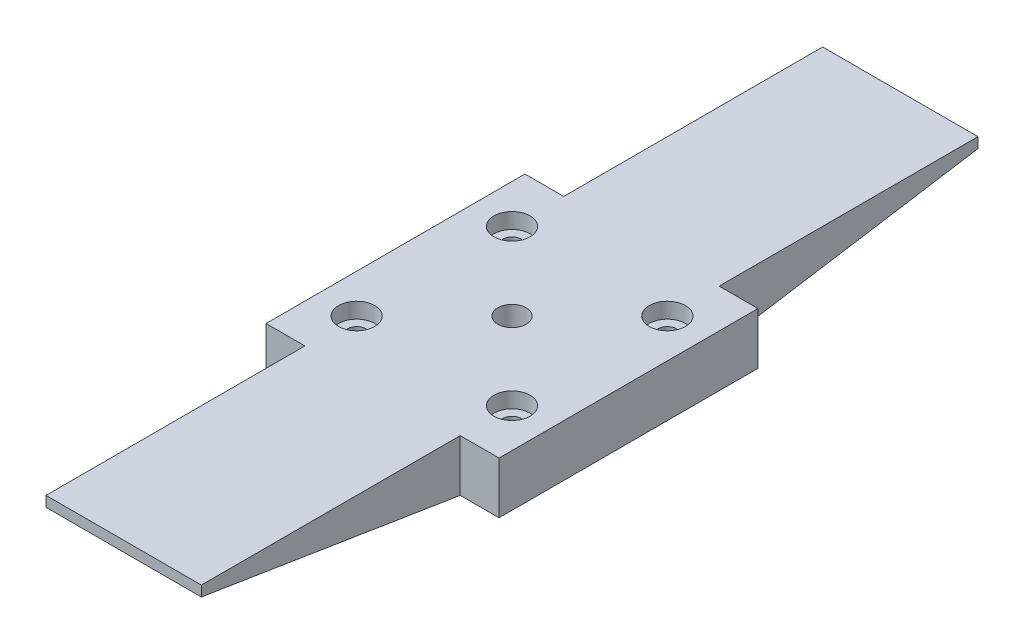
ISO-10303-21;
HEADER;
FILE_DESCRIPTION(('STEP AP214'),'2;1');
FILE_NAME('part.step','',(''),(''),'','','');
FILE_SCHEMA(('AUTOMOTIVE_DESIGN { 1 0 10303 214 1 1 1 1 }'));
ENDSEC;
DATA;
#1=APPLICATION_CONTEXT('core data for automotive mechanical design processes');
#2=APPLICATION_PROTOCOL_DEFINITION('international standard','automotive_design',2000,#1);
#3=PRODUCT_CONTEXT('',#1,'mechanical');
#4=PRODUCT('Part','Part','',(#3));
#5=PRODUCT_RELATED_PRODUCT_CATEGORY('part','',(#4));
#6=PRODUCT_DEFINITION_FORMATION('','',#4);
#7=PRODUCT_DEFINITION_CONTEXT('part definition',#1,'design');
#8=PRODUCT_DEFINITION('design','',#6,#7);
#9=PRODUCT_DEFINITION_SHAPE('','',#8);
#10=(LENGTH_UNIT() NAMED_UNIT(*) SI_UNIT(.MILLI.,.METRE.));
#11=(NAMED_UNIT(*) PLANE_ANGLE_UNIT() SI_UNIT($,.RADIAN.));
#12=(NAMED_UNIT(*) SI_UNIT($,.STERADIAN.) SOLID_ANGLE_UNIT());
#13=UNCERTAINTY_MEASURE_WITH_UNIT(LENGTH_MEASURE(1.E-05),#10,'distance_accuracy_value','');
#14=(GEOMETRIC_REPRESENTATION_CONTEXT(3) GLOBAL_UNCERTAINTY_ASSIGNED_CONTEXT((#13)) GLOBAL_UNIT_ASSIGNED_CONTEXT((#10,
#11,#12)) REPRESENTATION_CONTEXT('',''));
#15=CARTESIAN_POINT('',(0.,0.,0.));
#16=DIRECTION('',(0.,0.,1.));
#17=DIRECTION('',(1.,0.,0.));
#18=AXIS2_PLACEMENT_3D('',#15,#16,#17);
#19=CARTESIAN_POINT('',(45.,0.,-75.));
#20=DIRECTION('',(0.,0.,1.));
#21=DIRECTION('',(1.,0.,0.));
#22=AXIS2_PLACEMENT_3D('',#19,#20,#21);
#23=PLANE('',#22);
#24=DIRECTION('',(0.,1.,0.));
#25=VECTOR('',#24,1.);
#26=CARTESIAN_POINT('',(7.5,-2.,-75.));
#27=LINE('',#26,#25);
#28=CARTESIAN_POINT('',(7.5,-2.,-75.));
#29=VERTEX_POINT('',#28);
#30=CARTESIAN_POINT('',(7.5,0.,-75.));
#31=VERTEX_POINT('',#30);
#32=EDGE_CURVE('E143',#29,#31,#27,.T.);
#33=ORIENTED_EDGE('',*,*,#32,.T.);
#34=DIRECTION('',(-1.,0.,0.));
#35=VECTOR('',#34,1.);
#36=CARTESIAN_POINT('',(45.,0.,-75.));
#37=LINE('',#36,#35);
#38=CARTESIAN_POINT('',(37.5,0.,-75.));
#39=VERTEX_POINT('',#38);
#40=EDGE_CURVE('E11',#39,#31,#37,.T.);
#41=ORIENTED_EDGE('',*,*,#40,.F.);
#42=DIRECTION('',(0.,1.,0.));
#43=VECTOR('',#42,1.);
#44=CARTESIAN_POINT('',(37.5,-2.,-75.));
#45=LINE('',#44,#43);
#46=CARTESIAN_POINT('',(37.5,-2.,-75.));
#47=VERTEX_POINT('',#46);
#48=EDGE_CURVE('E261',#47,#39,#45,.T.);
#49=ORIENTED_EDGE('',*,*,#48,.F.);
#50=DIRECTION('',(-1.,0.,0.));
#51=VECTOR('',#50,1.);
#52=CARTESIAN_POINT('',(45.,-2.,-75.));
#53=LINE('',#52,#51);
#54=EDGE_CURVE('E164',#47,#29,#53,.T.);
#55=ORIENTED_EDGE('',*,*,#54,.T.);
#56=EDGE_LOOP('',(#33,#41,#49,#55));
#57=FACE_BOUND('',#56,.T.);
#58=ADVANCED_FACE('F37',(#57),#23,.F.);
#59=CARTESIAN_POINT('',(45.,-2.,-75.));
#60=DIRECTION('',(0.,0.987440631916705,0.157990501106673));
#61=DIRECTION('',(0.,-0.157990501106673,0.987440631916706));
#62=AXIS2_PLACEMENT_3D('',#59,#60,#61);
#63=PLANE('',#62);
#64=DIRECTION('',(0.,0.157990501106673,-0.987440631916706));
#65=VECTOR('',#64,1.);
#66=CARTESIAN_POINT('',(7.5,-10.,-25.));
#67=LINE('',#66,#65);
#68=CARTESIAN_POINT('',(7.5,-10.,-25.));
#69=VERTEX_POINT('',#68);
#70=EDGE_CURVE('E138',#69,#29,#67,.T.);
#71=ORIENTED_EDGE('',*,*,#70,.T.);
#72=ORIENTED_EDGE('',*,*,#54,.F.);
#73=DIRECTION('',(0.,0.157990501106673,-0.987440631916706));
#74=VECTOR('',#73,1.);
#75=CARTESIAN_POINT('',(37.5,-10.,-25.));
#76=LINE('',#75,#74);
#77=CARTESIAN_POINT('',(37.5,-10.,-25.));
#78=VERTEX_POINT('',#77);
#79=EDGE_CURVE('E162',#78,#47,#76,.T.);
#80=ORIENTED_EDGE('',*,*,#79,.F.);
#81=DIRECTION('',(-1.,0.,0.));
#82=VECTOR('',#81,1.);
#83=CARTESIAN_POINT('',(45.,-10.,-25.));
#84=LINE('',#83,#82);
#85=EDGE_CURVE('E155',#78,#69,#84,.T.);
#86=ORIENTED_EDGE('',*,*,#85,.T.);
#87=EDGE_LOOP('',(#71,#72,#80,#86));
#88=FACE_BOUND('',#87,.T.);
#89=ADVANCED_FACE('F161',(#88),#63,.F.);
#90=CARTESIAN_POINT('',(45.,0.,75.));
#91=DIRECTION('',(0.,-1.,0.));
#92=DIRECTION('',(0.,0.,-1.));
#93=AXIS2_PLACEMENT_3D('',#90,#91,#92);
#94=PLANE('',#93);
#95=CARTESIAN_POINT('',(22.5,0.,0.));
#96=DIRECTION('',(0.,-1.,0.));
#97=DIRECTION('',(0.,0.,-1.));
#98=AXIS2_PLACEMENT_3D('',#95,#96,#97);
#99=CIRCLE('',#98,2.75);
#100=CARTESIAN_POINT('',(22.5,0.,-2.75));
#101=VERTEX_POINT('',#100);
#102=EDGE_CURVE('E245',#101,#101,#99,.F.);
#103=ORIENTED_EDGE('',*,*,#102,.F.);
#104=EDGE_LOOP('',(#103));
#105=FACE_BOUND('',#104,.T.);
#106=CARTESIAN_POINT('',(37.5,0.,-15.));
#107=DIRECTION('',(0.,1.,0.));
#108=DIRECTION('',(0.,0.,1.));
#109=AXIS2_PLACEMENT_3D('',#106,#107,#108);
#110=CIRCLE('',#109,3.5);
#111=CARTESIAN_POINT('',(37.5,0.,-11.5));
#112=VERTEX_POINT('',#111);
#113=EDGE_CURVE('E293',#112,#112,#110,.T.);
#114=ORIENTED_EDGE('',*,*,#113,.F.);
#115=EDGE_LOOP('',(#114));
#116=FACE_BOUND('',#115,.T.);
#117=CARTESIAN_POINT('',(7.5,0.,15.));
#118=DIRECTION('',(0.,1.,0.));
#119=DIRECTION('',(0.,0.,1.));
#120=AXIS2_PLACEMENT_3D('',#117,#118,#119);
#121=CIRCLE('',#120,3.5);
#122=CARTESIAN_POINT('',(7.5,0.,18.5));
#123=VERTEX_POINT('',#122);
#124=EDGE_CURVE('E300',#123,#123,#121,.T.);
#125=ORIENTED_EDGE('',*,*,#124,.F.);
#126=EDGE_LOOP('',(#125));
#127=FACE_BOUND('',#126,.T.);
#128=CARTESIAN_POINT('',(37.5,0.,15.));
#129=DIRECTION('',(0.,1.,0.));
#130=DIRECTION('',(0.,0.,1.));
#131=AXIS2_PLACEMENT_3D('',#128,#129,#130);
#132=CIRCLE('',#131,3.5);
#133=CARTESIAN_POINT('',(37.5,0.,18.5));
#134=VERTEX_POINT('',#133);
#135=EDGE_CURVE('E287',#134,#134,#132,.T.);
#136=ORIENTED_EDGE('',*,*,#135,.F.);
#137=EDGE_LOOP('',(#136));
#138=FACE_BOUND('',#137,.T.);
#139=CARTESIAN_POINT('',(7.5,0.,-15.));
#140=DIRECTION('',(0.,1.,0.));
#141=DIRECTION('',(0.,0.,1.));
#142=AXIS2_PLACEMENT_3D('',#139,#140,#141);
#143=CIRCLE('',#142,3.5);
#144=CARTESIAN_POINT('',(7.5,0.,-11.5));
#145=VERTEX_POINT('',#144);
#146=EDGE_CURVE('E296',#145,#145,#143,.T.);
#147=ORIENTED_EDGE('',*,*,#146,.F.);
#148=EDGE_LOOP('',(#147));
#149=FACE_BOUND('',#148,.T.);
#150=DIRECTION('',(-1.,0.,0.));
#151=VECTOR('',#150,1.);
#152=CARTESIAN_POINT('',(7.5,0.,-25.));
#153=LINE('',#152,#151);
#154=CARTESIAN_POINT('',(7.5,0.,-25.));
#155=VERTEX_POINT('',#154);
#156=CARTESIAN_POINT('',(0.,0.,-25.));
#157=VERTEX_POINT('',#156);
#158=EDGE_CURVE('E134',#155,#157,#153,.T.);
#159=ORIENTED_EDGE('',*,*,#158,.T.);
#160=DIRECTION('',(0.,0.,1.));
#161=VECTOR('',#160,1.);
#162=CARTESIAN_POINT('',(0.,0.,75.));
#163=LINE('',#162,#161);
#164=CARTESIAN_POINT('',(0.,0.,25.));
#165=VERTEX_POINT('',#164);
#166=EDGE_CURVE('E228',#157,#165,#163,.T.);
#167=ORIENTED_EDGE('',*,*,#166,.T.);
#168=DIRECTION('',(-1.,0.,0.));
#169=VECTOR('',#168,1.);
#170=CARTESIAN_POINT('',(7.5,0.,25.));
#171=LINE('',#170,#169);
#172=CARTESIAN_POINT('',(7.5,0.,25.));
#173=VERTEX_POINT('',#172);
#174=EDGE_CURVE('E53',#173,#165,#171,.T.);
#175=ORIENTED_EDGE('',*,*,#174,.F.);
#176=DIRECTION('',(0.,0.,1.));
#177=VECTOR('',#176,1.);
#178=CARTESIAN_POINT('',(7.5,0.,25.));
#179=LINE('',#178,#177);
#180=CARTESIAN_POINT('',(7.5,0.,75.));
#181=VERTEX_POINT('',#180);
#182=EDGE_CURVE('E248',#173,#181,#179,.T.);
#183=ORIENTED_EDGE('',*,*,#182,.T.);
#184=DIRECTION('',(-1.,0.,0.));
#185=VECTOR('',#184,1.);
#186=CARTESIAN_POINT('',(45.,0.,75.));
#187=LINE('',#186,#185);
#188=CARTESIAN_POINT('',(37.5,0.,75.));
#189=VERTEX_POINT('',#188);
#190=EDGE_CURVE('E45',#189,#181,#187,.T.);
#191=ORIENTED_EDGE('',*,*,#190,.F.);
#192=DIRECTION('',(0.,0.,1.));
#193=VECTOR('',#192,1.);
#194=CARTESIAN_POINT('',(37.5,0.,25.));
#195=LINE('',#194,#193);
#196=CARTESIAN_POINT('',(37.5,0.,25.));
#197=VERTEX_POINT('',#196);
#198=EDGE_CURVE('E276',#197,#189,#195,.T.);
#199=ORIENTED_EDGE('',*,*,#198,.F.);
#200=DIRECTION('',(1.,0.,0.));
#201=VECTOR('',#200,1.);
#202=CARTESIAN_POINT('',(37.5,0.,25.));
#203=LINE('',#202,#201);
#204=CARTESIAN_POINT('',(45.,0.,25.));
#205=VERTEX_POINT('',#204);
#206=EDGE_CURVE('E273',#197,#205,#203,.T.);
#207=ORIENTED_EDGE('',*,*,#206,.T.);
#208=DIRECTION('',(0.,0.,1.));
#209=VECTOR('',#208,1.);
#210=CARTESIAN_POINT('',(45.,0.,75.));
#211=LINE('',#210,#209);
#212=CARTESIAN_POINT('',(45.,0.,-25.));
#213=VERTEX_POINT('',#212);
#214=EDGE_CURVE('E231',#213,#205,#211,.T.);
#215=ORIENTED_EDGE('',*,*,#214,.F.);
#216=DIRECTION('',(1.,0.,0.));
#217=VECTOR('',#216,1.);
#218=CARTESIAN_POINT('',(37.5,0.,-25.));
#219=LINE('',#218,#217);
#220=CARTESIAN_POINT('',(37.5,0.,-25.));
#221=VERTEX_POINT('',#220);
#222=EDGE_CURVE('E61',#221,#213,#219,.T.);
#223=ORIENTED_EDGE('',*,*,#222,.F.);
#224=DIRECTION('',(0.,0.,1.));
#225=VECTOR('',#224,1.);
#226=CARTESIAN_POINT('',(37.5,0.,-75.));
#227=LINE('',#226,#225);
#228=EDGE_CURVE('E264',#39,#221,#227,.T.);
#229=ORIENTED_EDGE('',*,*,#228,.F.);
#230=ORIENTED_EDGE('',*,*,#40,.T.);
#231=DIRECTION('',(0.,0.,1.));
#232=VECTOR('',#231,1.);
#233=CARTESIAN_POINT('',(7.5,0.,-75.));
#234=LINE('',#233,#232);
#235=EDGE_CURVE('E137',#31,#155,#234,.T.);
#236=ORIENTED_EDGE('',*,*,#235,.T.);
#237=EDGE_LOOP('',(#159,#167,#175,#183,#191,#199,#207,#215,#223,#229,#230,#236));
#238=FACE_BOUND('',#237,.T.);
#239=ADVANCED_FACE('F239',(#105,#116,#127,#138,#149,#238),#94,.F.);
#240=CARTESIAN_POINT('',(0.,0.,0.));
#241=DIRECTION('',(-1.,0.,0.));
#242=DIRECTION('',(0.,0.,1.));
#243=AXIS2_PLACEMENT_3D('',#240,#241,#242);
#244=PLANE('',#243);
#245=ORIENTED_EDGE('',*,*,#166,.F.);
#246=DIRECTION('',(0.,-1.,0.));
#247=VECTOR('',#246,1.);
#248=CARTESIAN_POINT('',(0.,-10.,-25.));
#249=LINE('',#248,#247);
#250=CARTESIAN_POINT('',(0.,-10.,-25.));
#251=VERTEX_POINT('',#250);
#252=EDGE_CURVE('E148',#157,#251,#249,.T.);
#253=ORIENTED_EDGE('',*,*,#252,.T.);
#254=DIRECTION('',(0.,0.,-1.));
#255=VECTOR('',#254,1.);
#256=CARTESIAN_POINT('',(0.,-10.,-25.));
#257=LINE('',#256,#255);
#258=CARTESIAN_POINT('',(0.,-10.,25.));
#259=VERTEX_POINT('',#258);
#260=EDGE_CURVE('E158',#259,#251,#257,.T.);
#261=ORIENTED_EDGE('',*,*,#260,.F.);
#262=DIRECTION('',(0.,1.,0.));
#263=VECTOR('',#262,1.);
#264=CARTESIAN_POINT('',(0.,-10.,25.));
#265=LINE('',#264,#263);
#266=EDGE_CURVE('E243',#259,#165,#265,.T.);
#267=ORIENTED_EDGE('',*,*,#266,.T.);
#268=EDGE_LOOP('',(#245,#253,#261,#267));
#269=FACE_BOUND('',#268,.T.);
#270=ADVANCED_FACE('F242',(#269),#244,.T.);
#271=CARTESIAN_POINT('',(7.5,4.94974746830584,15.));
#272=DIRECTION('',(0.,-1.,0.));
#273=DIRECTION('',(0.,0.,-1.));
#274=AXIS2_PLACEMENT_3D('',#271,#272,#273);
#275=CYLINDRICAL_SURFACE('',#274,1.75);
#276=CARTESIAN_POINT('',(7.5,-8.,15.));
#277=DIRECTION('',(0.,-1.,0.));
#278=DIRECTION('',(0.,0.,-1.));
#279=AXIS2_PLACEMENT_3D('',#276,#277,#278);
#280=CIRCLE('',#279,1.75);
#281=CARTESIAN_POINT('',(7.5,-8.,13.25));
#282=VERTEX_POINT('',#281);
#283=EDGE_CURVE('E203',#282,#282,#280,.T.);
#284=ORIENTED_EDGE('',*,*,#283,.T.);
#285=EDGE_LOOP('',(#284));
#286=FACE_BOUND('',#285,.T.);
#287=CARTESIAN_POINT('',(7.5,-3.,15.));
#288=DIRECTION('',(0.,1.,0.));
#289=DIRECTION('',(0.,0.,1.));
#290=AXIS2_PLACEMENT_3D('',#287,#288,#289);
#291=CIRCLE('',#290,1.75);
#292=CARTESIAN_POINT('',(7.5,-3.,16.75));
#293=VERTEX_POINT('',#292);
#294=EDGE_CURVE('E40',#293,#293,#291,.F.);
#295=ORIENTED_EDGE('',*,*,#294,.F.);
#296=EDGE_LOOP('',(#295));
#297=FACE_BOUND('',#296,.T.);
#298=ADVANCED_FACE('F457',(#286,#297),#275,.F.);
#299=CARTESIAN_POINT('',(7.5,4.94974746830584,-15.));
#300=DIRECTION('',(0.,-1.,0.));
#301=DIRECTION('',(0.,0.,-1.));
#302=AXIS2_PLACEMENT_3D('',#299,#300,#301);
#303=CYLINDRICAL_SURFACE('',#302,1.75);
#304=CARTESIAN_POINT('',(7.5,-8.,-15.));
#305=DIRECTION('',(0.,-1.,0.));
#306=DIRECTION('',(0.,0.,-1.));
#307=AXIS2_PLACEMENT_3D('',#304,#305,#306);
#308=CIRCLE('',#307,1.75);
#309=CARTESIAN_POINT('',(7.5,-8.,-16.75));
#310=VERTEX_POINT('',#309);
#311=EDGE_CURVE('E199',#310,#310,#308,.T.);
#312=ORIENTED_EDGE('',*,*,#311,.T.);
#313=EDGE_LOOP('',(#312));
#314=FACE_BOUND('',#313,.T.);
#315=CARTESIAN_POINT('',(7.5,-3.,-15.));
#316=DIRECTION('',(0.,1.,0.));
#317=DIRECTION('',(0.,0.,1.));
#318=AXIS2_PLACEMENT_3D('',#315,#316,#317);
#319=CIRCLE('',#318,1.75);
#320=CARTESIAN_POINT('',(7.5,-3.,-13.25));
#321=VERTEX_POINT('',#320);
#322=EDGE_CURVE('E185',#321,#321,#319,.F.);
#323=ORIENTED_EDGE('',*,*,#322,.F.);
#324=EDGE_LOOP('',(#323));
#325=FACE_BOUND('',#324,.T.);
#326=ADVANCED_FACE('F311',(#314,#325),#303,.F.);
#327=CARTESIAN_POINT('',(37.5,4.94974746830584,-15.));
#328=DIRECTION('',(0.,-1.,0.));
#329=DIRECTION('',(0.,0.,-1.));
#330=AXIS2_PLACEMENT_3D('',#327,#328,#329);
#331=CYLINDRICAL_SURFACE('',#330,1.75);
#332=CARTESIAN_POINT('',(37.5,-8.,-15.));
#333=DIRECTION('',(0.,-1.,0.));
#334=DIRECTION('',(0.,0.,-1.));
#335=AXIS2_PLACEMENT_3D('',#332,#333,#334);
#336=CIRCLE('',#335,1.75);
#337=CARTESIAN_POINT('',(37.5,-8.,-16.75));
#338=VERTEX_POINT('',#337);
#339=EDGE_CURVE('E194',#338,#338,#336,.T.);
#340=ORIENTED_EDGE('',*,*,#339,.T.);
#341=EDGE_LOOP('',(#340));
#342=FACE_BOUND('',#341,.T.);
#343=CARTESIAN_POINT('',(37.5,-3.,-15.));
#344=DIRECTION('',(0.,1.,0.));
#345=DIRECTION('',(0.,0.,1.));
#346=AXIS2_PLACEMENT_3D('',#343,#344,#345);
#347=CIRCLE('',#346,1.75);
#348=CARTESIAN_POINT('',(37.5,-3.,-13.25));
#349=VERTEX_POINT('',#348);
#350=EDGE_CURVE('E182',#349,#349,#347,.F.);
#351=ORIENTED_EDGE('',*,*,#350,.F.);
#352=EDGE_LOOP('',(#351));
#353=FACE_BOUND('',#352,.T.);
#354=ADVANCED_FACE('F456',(#342,#353),#331,.F.);
#355=CARTESIAN_POINT('',(37.5,4.94974746830584,15.));
#356=DIRECTION('',(0.,-1.,0.));
#357=DIRECTION('',(0.,0.,-1.));
#358=AXIS2_PLACEMENT_3D('',#355,#356,#357);
#359=CYLINDRICAL_SURFACE('',#358,1.75);
#360=CARTESIAN_POINT('',(37.5,-8.,15.));
#361=DIRECTION('',(0.,-1.,0.));
#362=DIRECTION('',(0.,0.,-1.));
#363=AXIS2_PLACEMENT_3D('',#360,#361,#362);
#364=CIRCLE('',#363,1.75);
#365=CARTESIAN_POINT('',(37.5,-8.,13.25));
#366=VERTEX_POINT('',#365);
#367=EDGE_CURVE('E190',#366,#366,#364,.T.);
#368=ORIENTED_EDGE('',*,*,#367,.T.);
#369=EDGE_LOOP('',(#368));
#370=FACE_BOUND('',#369,.T.);
#371=CARTESIAN_POINT('',(37.5,-3.,15.));
#372=DIRECTION('',(0.,1.,0.));
#373=DIRECTION('',(0.,0.,1.));
#374=AXIS2_PLACEMENT_3D('',#371,#372,#373);
#375=CIRCLE('',#374,1.75);
#376=CARTESIAN_POINT('',(37.5,-3.,16.75));
#377=VERTEX_POINT('',#376);
#378=EDGE_CURVE('E179',#377,#377,#375,.F.);
#379=ORIENTED_EDGE('',*,*,#378,.F.);
#380=EDGE_LOOP('',(#379));
#381=FACE_BOUND('',#380,.T.);
#382=ADVANCED_FACE('F460',(#370,#381),#359,.F.);
#383=CARTESIAN_POINT('',(45.,0.,75.));
#384=DIRECTION('',(0.,0.,-1.));
#385=DIRECTION('',(-1.,0.,0.));
#386=AXIS2_PLACEMENT_3D('',#383,#384,#385);
#387=PLANE('',#386);
#388=ORIENTED_EDGE('',*,*,#190,.T.);
#389=DIRECTION('',(0.,-1.,0.));
#390=VECTOR('',#389,1.);
#391=CARTESIAN_POINT('',(7.5,0.,75.));
#392=LINE('',#391,#390);
#393=CARTESIAN_POINT('',(7.5,-2.,75.));
#394=VERTEX_POINT('',#393);
#395=EDGE_CURVE('E244',#181,#394,#392,.T.);
#396=ORIENTED_EDGE('',*,*,#395,.T.);
#397=DIRECTION('',(-1.,0.,0.));
#398=VECTOR('',#397,1.);
#399=CARTESIAN_POINT('',(45.,-2.,75.));
#400=LINE('',#399,#398);
#401=CARTESIAN_POINT('',(37.5,-2.,75.));
#402=VERTEX_POINT('',#401);
#403=EDGE_CURVE('E174',#402,#394,#400,.T.);
#404=ORIENTED_EDGE('',*,*,#403,.F.);
#405=DIRECTION('',(0.,-1.,0.));
#406=VECTOR('',#405,1.);
#407=CARTESIAN_POINT('',(37.5,0.,75.));
#408=LINE('',#407,#406);
#409=EDGE_CURVE('E278',#189,#402,#408,.T.);
#410=ORIENTED_EDGE('',*,*,#409,.F.);
#411=EDGE_LOOP('',(#388,#396,#404,#410));
#412=FACE_BOUND('',#411,.T.);
#413=ADVANCED_FACE('F382',(#412),#387,.F.);
#414=CARTESIAN_POINT('',(45.,-2.,75.));
#415=DIRECTION('',(0.,0.987440631916705,-0.157990501106673));
#416=DIRECTION('',(0.,0.157990501106673,0.987440631916706));
#417=AXIS2_PLACEMENT_3D('',#414,#415,#416);
#418=PLANE('',#417);
#419=ORIENTED_EDGE('',*,*,#403,.T.);
#420=DIRECTION('',(0.,-0.157990501106673,-0.987440631916706));
#421=VECTOR('',#420,1.);
#422=CARTESIAN_POINT('',(7.5,-2.,75.));
#423=LINE('',#422,#421);
#424=CARTESIAN_POINT('',(7.5,-10.,25.));
#425=VERTEX_POINT('',#424);
#426=EDGE_CURVE('E255',#394,#425,#423,.T.);
#427=ORIENTED_EDGE('',*,*,#426,.T.);
#428=DIRECTION('',(-1.,0.,0.));
#429=VECTOR('',#428,1.);
#430=CARTESIAN_POINT('',(45.,-10.,25.));
#431=LINE('',#430,#429);
#432=CARTESIAN_POINT('',(37.5,-10.,25.));
#433=VERTEX_POINT('',#432);
#434=EDGE_CURVE('E166',#433,#425,#431,.T.);
#435=ORIENTED_EDGE('',*,*,#434,.F.);
#436=DIRECTION('',(0.,-0.157990501106673,-0.987440631916706));
#437=VECTOR('',#436,1.);
#438=CARTESIAN_POINT('',(37.5,-2.,75.));
#439=LINE('',#438,#437);
#440=EDGE_CURVE('E283',#402,#433,#439,.T.);
#441=ORIENTED_EDGE('',*,*,#440,.F.);
#442=EDGE_LOOP('',(#419,#427,#435,#441));
#443=FACE_BOUND('',#442,.T.);
#444=ADVANCED_FACE('F331',(#443),#418,.F.);
#445=CARTESIAN_POINT('',(45.,-10.,-25.));
#446=DIRECTION('',(0.,1.,0.));
#447=DIRECTION('',(0.,0.,1.));
#448=AXIS2_PLACEMENT_3D('',#445,#446,#447);
#449=PLANE('',#448);
#450=CARTESIAN_POINT('',(22.5,-10.,0.));
#451=DIRECTION('',(0.,-1.,0.));
#452=DIRECTION('',(0.,0.,-1.));
#453=AXIS2_PLACEMENT_3D('',#450,#451,#452);
#454=CIRCLE('',#453,2.75);
#455=CARTESIAN_POINT('',(22.5,-10.,-2.75));
#456=VERTEX_POINT('',#455);
#457=EDGE_CURVE('E251',#456,#456,#454,.T.);
#458=ORIENTED_EDGE('',*,*,#457,.F.);
#459=EDGE_LOOP('',(#458));
#460=FACE_BOUND('',#459,.T.);
#461=CARTESIAN_POINT('',(7.5,-10.,-15.));
#462=DIRECTION('',(0.,-1.,0.));
#463=DIRECTION('',(0.,0.,-1.));
#464=AXIS2_PLACEMENT_3D('',#461,#462,#463);
#465=CIRCLE('',#464,3.5);
#466=CARTESIAN_POINT('',(7.5,-10.,-18.5));
#467=VERTEX_POINT('',#466);
#468=EDGE_CURVE('E220',#467,#467,#465,.T.);
#469=ORIENTED_EDGE('',*,*,#468,.F.);
#470=EDGE_LOOP('',(#469));
#471=FACE_BOUND('',#470,.T.);
#472=CARTESIAN_POINT('',(37.5,-10.,-15.));
#473=DIRECTION('',(0.,-1.,0.));
#474=DIRECTION('',(0.,0.,-1.));
#475=AXIS2_PLACEMENT_3D('',#472,#473,#474);
#476=CIRCLE('',#475,3.5);
#477=CARTESIAN_POINT('',(37.5,-10.,-18.5));
#478=VERTEX_POINT('',#477);
#479=EDGE_CURVE('E214',#478,#478,#476,.T.);
#480=ORIENTED_EDGE('',*,*,#479,.F.);
#481=EDGE_LOOP('',(#480));
#482=FACE_BOUND('',#481,.T.);
#483=CARTESIAN_POINT('',(37.5,-10.,15.));
#484=DIRECTION('',(0.,-1.,0.));
#485=DIRECTION('',(0.,0.,-1.));
#486=AXIS2_PLACEMENT_3D('',#483,#484,#485);
#487=CIRCLE('',#486,3.5);
#488=CARTESIAN_POINT('',(37.5,-10.,11.5));
#489=VERTEX_POINT('',#488);
#490=EDGE_CURVE('E207',#489,#489,#487,.T.);
#491=ORIENTED_EDGE('',*,*,#490,.F.);
#492=EDGE_LOOP('',(#491));
#493=FACE_BOUND('',#492,.T.);
#494=CARTESIAN_POINT('',(7.5,-10.,15.));
#495=DIRECTION('',(0.,-1.,0.));
#496=DIRECTION('',(0.,0.,-1.));
#497=AXIS2_PLACEMENT_3D('',#494,#495,#496);
#498=CIRCLE('',#497,3.5);
#499=CARTESIAN_POINT('',(7.5,-10.,11.5));
#500=VERTEX_POINT('',#499);
#501=EDGE_CURVE('E210',#500,#500,#498,.T.);
#502=ORIENTED_EDGE('',*,*,#501,.F.);
#503=EDGE_LOOP('',(#502));
#504=FACE_BOUND('',#503,.T.);
#505=ORIENTED_EDGE('',*,*,#260,.T.);
#506=DIRECTION('',(-1.,0.,0.));
#507=VECTOR('',#506,1.);
#508=CARTESIAN_POINT('',(7.5,-10.,-25.));
#509=LINE('',#508,#507);
#510=EDGE_CURVE('E131',#69,#251,#509,.T.);
#511=ORIENTED_EDGE('',*,*,#510,.F.);
#512=ORIENTED_EDGE('',*,*,#85,.F.);
#513=CARTESIAN_POINT('',(45.,-10.,-25.));
#514=VERTEX_POINT('',#513);
#515=EDGE_CURVE('E163',#514,#78,#84,.T.);
#516=ORIENTED_EDGE('',*,*,#515,.F.);
#517=DIRECTION('',(0.,0.,-1.));
#518=VECTOR('',#517,1.);
#519=CARTESIAN_POINT('',(45.,-10.,-25.));
#520=LINE('',#519,#518);
#521=CARTESIAN_POINT('',(45.,-10.,25.));
#522=VERTEX_POINT('',#521);
#523=EDGE_CURVE('E167',#522,#514,#520,.T.);
#524=ORIENTED_EDGE('',*,*,#523,.F.);
#525=EDGE_CURVE('E171',#522,#433,#431,.T.);
#526=ORIENTED_EDGE('',*,*,#525,.T.);
#527=ORIENTED_EDGE('',*,*,#434,.T.);
#528=DIRECTION('',(-1.,0.,0.));
#529=VECTOR('',#528,1.);
#530=CARTESIAN_POINT('',(7.5,-10.,25.));
#531=LINE('',#530,#529);
#532=EDGE_CURVE('E257',#425,#259,#531,.T.);
#533=ORIENTED_EDGE('',*,*,#532,.T.);
#534=EDGE_LOOP('',(#505,#511,#512,#516,#524,#526,#527,#533));
#535=FACE_BOUND('',#534,.T.);
#536=ADVANCED_FACE('F153',(#460,#471,#482,#493,#504,#535),#449,.F.);
#537=CARTESIAN_POINT('',(45.,0.,0.));
#538=DIRECTION('',(-1.,0.,0.));
#539=DIRECTION('',(0.,0.,1.));
#540=AXIS2_PLACEMENT_3D('',#537,#538,#539);
#541=PLANE('',#540);
#542=ORIENTED_EDGE('',*,*,#523,.T.);
#543=DIRECTION('',(0.,-1.,0.));
#544=VECTOR('',#543,1.);
#545=CARTESIAN_POINT('',(45.,-10.,-25.));
#546=LINE('',#545,#544);
#547=EDGE_CURVE('E262',#213,#514,#546,.T.);
#548=ORIENTED_EDGE('',*,*,#547,.F.);
#549=ORIENTED_EDGE('',*,*,#214,.T.);
#550=DIRECTION('',(0.,1.,0.));
#551=VECTOR('',#550,1.);
#552=CARTESIAN_POINT('',(45.,-10.,25.));
#553=LINE('',#552,#551);
#554=EDGE_CURVE('E270',#522,#205,#553,.T.);
#555=ORIENTED_EDGE('',*,*,#554,.F.);
#556=EDGE_LOOP('',(#542,#548,#549,#555));
#557=FACE_BOUND('',#556,.T.);
#558=ADVANCED_FACE('F330',(#557),#541,.F.);
#559=CARTESIAN_POINT('',(7.5,-8.,15.));
#560=DIRECTION('',(0.,-1.,0.));
#561=DIRECTION('',(0.,0.,-1.));
#562=AXIS2_PLACEMENT_3D('',#559,#560,#561);
#563=CYLINDRICAL_SURFACE('',#562,3.5);
#564=CARTESIAN_POINT('',(7.5,-8.,15.));
#565=DIRECTION('',(0.,-1.,0.));
#566=DIRECTION('',(0.,0.,-1.));
#567=AXIS2_PLACEMENT_3D('',#564,#565,#566);
#568=CIRCLE('',#567,3.5);
#569=CARTESIAN_POINT('',(7.5,-8.,11.5));
#570=VERTEX_POINT('',#569);
#571=EDGE_CURVE('E225',#570,#570,#568,.T.);
#572=ORIENTED_EDGE('',*,*,#571,.F.);
#573=EDGE_LOOP('',(#572));
#574=FACE_BOUND('',#573,.T.);
#575=ORIENTED_EDGE('',*,*,#501,.T.);
#576=EDGE_LOOP('',(#575));
#577=FACE_BOUND('',#576,.T.);
#578=ADVANCED_FACE('F340',(#574,#577),#563,.F.);
#579=CARTESIAN_POINT('',(7.5,-8.,15.));
#580=DIRECTION('',(0.,-1.,0.));
#581=DIRECTION('',(0.,0.,-1.));
#582=AXIS2_PLACEMENT_3D('',#579,#580,#581);
#583=PLANE('',#582);
#584=ORIENTED_EDGE('',*,*,#283,.F.);
#585=EDGE_LOOP('',(#584));
#586=FACE_BOUND('',#585,.T.);
#587=ORIENTED_EDGE('',*,*,#571,.T.);
#588=EDGE_LOOP('',(#587));
#589=FACE_BOUND('',#588,.T.);
#590=ADVANCED_FACE('F342',(#586,#589),#583,.T.);
#591=CARTESIAN_POINT('',(37.5,-8.,15.));
#592=DIRECTION('',(0.,-1.,0.));
#593=DIRECTION('',(0.,0.,-1.));
#594=AXIS2_PLACEMENT_3D('',#591,#592,#593);
#595=CYLINDRICAL_SURFACE('',#594,3.5);
#596=CARTESIAN_POINT('',(37.5,-8.,15.));
#597=DIRECTION('',(0.,-1.,0.));
#598=DIRECTION('',(0.,0.,-1.));
#599=AXIS2_PLACEMENT_3D('',#596,#597,#598);
#600=CIRCLE('',#599,3.5);
#601=CARTESIAN_POINT('',(37.5,-8.,11.5));
#602=VERTEX_POINT('',#601);
#603=EDGE_CURVE('E211',#602,#602,#600,.T.);
#604=ORIENTED_EDGE('',*,*,#603,.F.);
#605=EDGE_LOOP('',(#604));
#606=FACE_BOUND('',#605,.T.);
#607=ORIENTED_EDGE('',*,*,#490,.T.);
#608=EDGE_LOOP('',(#607));
#609=FACE_BOUND('',#608,.T.);
#610=ADVANCED_FACE('F349',(#606,#609),#595,.F.);
#611=CARTESIAN_POINT('',(37.5,-8.,15.));
#612=DIRECTION('',(0.,-1.,0.));
#613=DIRECTION('',(0.,0.,-1.));
#614=AXIS2_PLACEMENT_3D('',#611,#612,#613);
#615=PLANE('',#614);
#616=ORIENTED_EDGE('',*,*,#367,.F.);
#617=EDGE_LOOP('',(#616));
#618=FACE_BOUND('',#617,.T.);
#619=ORIENTED_EDGE('',*,*,#603,.T.);
#620=EDGE_LOOP('',(#619));
#621=FACE_BOUND('',#620,.T.);
#622=ADVANCED_FACE('F469',(#618,#621),#615,.T.);
#623=CARTESIAN_POINT('',(37.5,-8.,-15.));
#624=DIRECTION('',(0.,-1.,0.));
#625=DIRECTION('',(0.,0.,-1.));
#626=AXIS2_PLACEMENT_3D('',#623,#624,#625);
#627=CYLINDRICAL_SURFACE('',#626,3.5);
#628=CARTESIAN_POINT('',(37.5,-8.,-15.));
#629=DIRECTION('',(0.,-1.,0.));
#630=DIRECTION('',(0.,0.,-1.));
#631=AXIS2_PLACEMENT_3D('',#628,#629,#630);
#632=CIRCLE('',#631,3.5);
#633=CARTESIAN_POINT('',(37.5,-8.,-18.5));
#634=VERTEX_POINT('',#633);
#635=EDGE_CURVE('E217',#634,#634,#632,.T.);
#636=ORIENTED_EDGE('',*,*,#635,.F.);
#637=EDGE_LOOP('',(#636));
#638=FACE_BOUND('',#637,.T.);
#639=ORIENTED_EDGE('',*,*,#479,.T.);
#640=EDGE_LOOP('',(#639));
#641=FACE_BOUND('',#640,.T.);
#642=ADVANCED_FACE('F473',(#638,#641),#627,.F.);
#643=CARTESIAN_POINT('',(37.5,-8.,-15.));
#644=DIRECTION('',(0.,-1.,0.));
#645=DIRECTION('',(0.,0.,-1.));
#646=AXIS2_PLACEMENT_3D('',#643,#644,#645);
#647=PLANE('',#646);
#648=ORIENTED_EDGE('',*,*,#339,.F.);
#649=EDGE_LOOP('',(#648));
#650=FACE_BOUND('',#649,.T.);
#651=ORIENTED_EDGE('',*,*,#635,.T.);
#652=EDGE_LOOP('',(#651));
#653=FACE_BOUND('',#652,.T.);
#654=ADVANCED_FACE('F324',(#650,#653),#647,.T.);
#655=CARTESIAN_POINT('',(7.5,-8.,-15.));
#656=DIRECTION('',(0.,-1.,0.));
#657=DIRECTION('',(0.,0.,-1.));
#658=AXIS2_PLACEMENT_3D('',#655,#656,#657);
#659=CYLINDRICAL_SURFACE('',#658,3.5);
#660=CARTESIAN_POINT('',(7.5,-8.,-15.));
#661=DIRECTION('',(0.,-1.,0.));
#662=DIRECTION('',(0.,0.,-1.));
#663=AXIS2_PLACEMENT_3D('',#660,#661,#662);
#664=CIRCLE('',#663,3.5);
#665=CARTESIAN_POINT('',(7.5,-8.,-18.5));
#666=VERTEX_POINT('',#665);
#667=EDGE_CURVE('E206',#666,#666,#664,.T.);
#668=ORIENTED_EDGE('',*,*,#667,.F.);
#669=EDGE_LOOP('',(#668));
#670=FACE_BOUND('',#669,.T.);
#671=ORIENTED_EDGE('',*,*,#468,.T.);
#672=EDGE_LOOP('',(#671));
#673=FACE_BOUND('',#672,.T.);
#674=ADVANCED_FACE('F318',(#670,#673),#659,.F.);
#675=CARTESIAN_POINT('',(7.5,-8.,-15.));
#676=DIRECTION('',(0.,-1.,0.));
#677=DIRECTION('',(0.,0.,-1.));
#678=AXIS2_PLACEMENT_3D('',#675,#676,#677);
#679=PLANE('',#678);
#680=ORIENTED_EDGE('',*,*,#311,.F.);
#681=EDGE_LOOP('',(#680));
#682=FACE_BOUND('',#681,.T.);
#683=ORIENTED_EDGE('',*,*,#667,.T.);
#684=EDGE_LOOP('',(#683));
#685=FACE_BOUND('',#684,.T.);
#686=ADVANCED_FACE('F314',(#682,#685),#679,.T.);
#687=CARTESIAN_POINT('',(37.5,-3.,15.));
#688=DIRECTION('',(0.,1.,0.));
#689=DIRECTION('',(0.,0.,1.));
#690=AXIS2_PLACEMENT_3D('',#687,#688,#689);
#691=PLANE('',#690);
#692=CARTESIAN_POINT('',(37.5,-3.,15.));
#693=DIRECTION('',(0.,1.,0.));
#694=DIRECTION('',(0.,0.,1.));
#695=AXIS2_PLACEMENT_3D('',#692,#693,#694);
#696=CIRCLE('',#695,3.5);
#697=CARTESIAN_POINT('',(37.5,-3.,18.5));
#698=VERTEX_POINT('',#697);
#699=EDGE_CURVE('E272',#698,#698,#696,.T.);
#700=ORIENTED_EDGE('',*,*,#699,.T.);
#701=EDGE_LOOP('',(#700));
#702=FACE_BOUND('',#701,.T.);
#703=ORIENTED_EDGE('',*,*,#378,.T.);
#704=EDGE_LOOP('',(#703));
#705=FACE_BOUND('',#704,.T.);
#706=ADVANCED_FACE('F317',(#702,#705),#691,.T.);
#707=CARTESIAN_POINT('',(37.5,-3.,15.));
#708=DIRECTION('',(0.,1.,0.));
#709=DIRECTION('',(0.,0.,1.));
#710=AXIS2_PLACEMENT_3D('',#707,#708,#709);
#711=CYLINDRICAL_SURFACE('',#710,3.5);
#712=ORIENTED_EDGE('',*,*,#699,.F.);
#713=EDGE_LOOP('',(#712));
#714=FACE_BOUND('',#713,.T.);
#715=ORIENTED_EDGE('',*,*,#135,.T.);
#716=EDGE_LOOP('',(#715));
#717=FACE_BOUND('',#716,.T.);
#718=ADVANCED_FACE('F424',(#714,#717),#711,.F.);
#719=CARTESIAN_POINT('',(37.5,-3.,-15.));
#720=DIRECTION('',(0.,1.,0.));
#721=DIRECTION('',(0.,0.,1.));
#722=AXIS2_PLACEMENT_3D('',#719,#720,#721);
#723=PLANE('',#722);
#724=CARTESIAN_POINT('',(37.5,-3.,-15.));
#725=DIRECTION('',(0.,1.,0.));
#726=DIRECTION('',(0.,0.,1.));
#727=AXIS2_PLACEMENT_3D('',#724,#725,#726);
#728=CIRCLE('',#727,3.5);
#729=CARTESIAN_POINT('',(37.5,-3.,-11.5));
#730=VERTEX_POINT('',#729);
#731=EDGE_CURVE('E297',#730,#730,#728,.T.);
#732=ORIENTED_EDGE('',*,*,#731,.T.);
#733=EDGE_LOOP('',(#732));
#734=FACE_BOUND('',#733,.T.);
#735=ORIENTED_EDGE('',*,*,#350,.T.);
#736=EDGE_LOOP('',(#735));
#737=FACE_BOUND('',#736,.T.);
#738=ADVANCED_FACE('F427',(#734,#737),#723,.T.);
#739=CARTESIAN_POINT('',(37.5,-3.,-15.));
#740=DIRECTION('',(0.,1.,0.));
#741=DIRECTION('',(0.,0.,1.));
#742=AXIS2_PLACEMENT_3D('',#739,#740,#741);
#743=CYLINDRICAL_SURFACE('',#742,3.5);
#744=ORIENTED_EDGE('',*,*,#731,.F.);
#745=EDGE_LOOP('',(#744));
#746=FACE_BOUND('',#745,.T.);
#747=ORIENTED_EDGE('',*,*,#113,.T.);
#748=EDGE_LOOP('',(#747));
#749=FACE_BOUND('',#748,.T.);
#750=ADVANCED_FACE('F432',(#746,#749),#743,.F.);
#751=CARTESIAN_POINT('',(7.5,-3.,-15.));
#752=DIRECTION('',(0.,1.,0.));
#753=DIRECTION('',(0.,0.,1.));
#754=AXIS2_PLACEMENT_3D('',#751,#752,#753);
#755=PLANE('',#754);
#756=CARTESIAN_POINT('',(7.5,-3.,-15.));
#757=DIRECTION('',(0.,1.,0.));
#758=DIRECTION('',(0.,0.,1.));
#759=AXIS2_PLACEMENT_3D('',#756,#757,#758);
#760=CIRCLE('',#759,3.5);
#761=CARTESIAN_POINT('',(7.5,-3.,-11.5));
#762=VERTEX_POINT('',#761);
#763=EDGE_CURVE('E183',#762,#762,#760,.T.);
#764=ORIENTED_EDGE('',*,*,#763,.T.);
#765=EDGE_LOOP('',(#764));
#766=FACE_BOUND('',#765,.T.);
#767=ORIENTED_EDGE('',*,*,#322,.T.);
#768=EDGE_LOOP('',(#767));
#769=FACE_BOUND('',#768,.T.);
#770=ADVANCED_FACE('F435',(#766,#769),#755,.T.);
#771=CARTESIAN_POINT('',(7.5,-3.,-15.));
#772=DIRECTION('',(0.,1.,0.));
#773=DIRECTION('',(0.,0.,1.));
#774=AXIS2_PLACEMENT_3D('',#771,#772,#773);
#775=CYLINDRICAL_SURFACE('',#774,3.5);
#776=ORIENTED_EDGE('',*,*,#763,.F.);
#777=EDGE_LOOP('',(#776));
#778=FACE_BOUND('',#777,.T.);
#779=ORIENTED_EDGE('',*,*,#146,.T.);
#780=EDGE_LOOP('',(#779));
#781=FACE_BOUND('',#780,.T.);
#782=ADVANCED_FACE('F446',(#778,#781),#775,.F.);
#783=CARTESIAN_POINT('',(7.5,-3.,15.));
#784=DIRECTION('',(0.,1.,0.));
#785=DIRECTION('',(0.,0.,1.));
#786=AXIS2_PLACEMENT_3D('',#783,#784,#785);
#787=PLANE('',#786);
#788=CARTESIAN_POINT('',(7.5,-3.,15.));
#789=DIRECTION('',(0.,1.,0.));
#790=DIRECTION('',(0.,0.,1.));
#791=AXIS2_PLACEMENT_3D('',#788,#789,#790);
#792=CIRCLE('',#791,3.5);
#793=CARTESIAN_POINT('',(7.5,-3.,18.5));
#794=VERTEX_POINT('',#793);
#795=EDGE_CURVE('E290',#794,#794,#792,.T.);
#796=ORIENTED_EDGE('',*,*,#795,.T.);
#797=EDGE_LOOP('',(#796));
#798=FACE_BOUND('',#797,.T.);
#799=ORIENTED_EDGE('',*,*,#294,.T.);
#800=EDGE_LOOP('',(#799));
#801=FACE_BOUND('',#800,.T.);
#802=ADVANCED_FACE('F442',(#798,#801),#787,.T.);
#803=CARTESIAN_POINT('',(7.5,-3.,15.));
#804=DIRECTION('',(0.,1.,0.));
#805=DIRECTION('',(0.,0.,1.));
#806=AXIS2_PLACEMENT_3D('',#803,#804,#805);
#807=CYLINDRICAL_SURFACE('',#806,3.5);
#808=ORIENTED_EDGE('',*,*,#795,.F.);
#809=EDGE_LOOP('',(#808));
#810=FACE_BOUND('',#809,.T.);
#811=ORIENTED_EDGE('',*,*,#124,.T.);
#812=EDGE_LOOP('',(#811));
#813=FACE_BOUND('',#812,.T.);
#814=ADVANCED_FACE('F421',(#810,#813),#807,.F.);
#815=CARTESIAN_POINT('',(37.5,-10.,25.));
#816=DIRECTION('',(0.,0.,-1.));
#817=DIRECTION('',(0.,1.,0.));
#818=AXIS2_PLACEMENT_3D('',#815,#816,#817);
#819=PLANE('',#818);
#820=ORIENTED_EDGE('',*,*,#554,.T.);
#821=ORIENTED_EDGE('',*,*,#206,.F.);
#822=DIRECTION('',(0.,1.,0.));
#823=VECTOR('',#822,1.);
#824=CARTESIAN_POINT('',(37.5,-10.,25.));
#825=LINE('',#824,#823);
#826=EDGE_CURVE('E280',#433,#197,#825,.T.);
#827=ORIENTED_EDGE('',*,*,#826,.F.);
#828=ORIENTED_EDGE('',*,*,#525,.F.);
#829=EDGE_LOOP('',(#820,#821,#827,#828));
#830=FACE_BOUND('',#829,.T.);
#831=ADVANCED_FACE('F373',(#830),#819,.F.);
#832=CARTESIAN_POINT('',(37.5,0.,0.));
#833=DIRECTION('',(-1.,0.,0.));
#834=DIRECTION('',(0.,0.,1.));
#835=AXIS2_PLACEMENT_3D('',#832,#833,#834);
#836=PLANE('',#835);
#837=ORIENTED_EDGE('',*,*,#409,.T.);
#838=ORIENTED_EDGE('',*,*,#440,.T.);
#839=ORIENTED_EDGE('',*,*,#826,.T.);
#840=ORIENTED_EDGE('',*,*,#198,.T.);
#841=EDGE_LOOP('',(#837,#838,#839,#840));
#842=FACE_BOUND('',#841,.T.);
#843=ADVANCED_FACE('F378',(#842),#836,.F.);
#844=CARTESIAN_POINT('',(37.5,-10.,-25.));
#845=DIRECTION('',(0.,0.,1.));
#846=DIRECTION('',(1.,0.,0.));
#847=AXIS2_PLACEMENT_3D('',#844,#845,#846);
#848=PLANE('',#847);
#849=ORIENTED_EDGE('',*,*,#547,.T.);
#850=ORIENTED_EDGE('',*,*,#515,.T.);
#851=DIRECTION('',(0.,-1.,0.));
#852=VECTOR('',#851,1.);
#853=CARTESIAN_POINT('',(37.5,-10.,-25.));
#854=LINE('',#853,#852);
#855=EDGE_CURVE('E266',#221,#78,#854,.T.);
#856=ORIENTED_EDGE('',*,*,#855,.F.);
#857=ORIENTED_EDGE('',*,*,#222,.T.);
#858=EDGE_LOOP('',(#849,#850,#856,#857));
#859=FACE_BOUND('',#858,.T.);
#860=ADVANCED_FACE('F368',(#859),#848,.F.);
#861=CARTESIAN_POINT('',(37.5,0.,0.));
#862=DIRECTION('',(1.,0.,0.));
#863=DIRECTION('',(0.,0.,-1.));
#864=AXIS2_PLACEMENT_3D('',#861,#862,#863);
#865=PLANE('',#864);
#866=ORIENTED_EDGE('',*,*,#79,.T.);
#867=ORIENTED_EDGE('',*,*,#48,.T.);
#868=ORIENTED_EDGE('',*,*,#228,.T.);
#869=ORIENTED_EDGE('',*,*,#855,.T.);
#870=EDGE_LOOP('',(#866,#867,#868,#869));
#871=FACE_BOUND('',#870,.T.);
#872=ADVANCED_FACE('F367',(#871),#865,.T.);
#873=CARTESIAN_POINT('',(7.5,-10.,25.));
#874=DIRECTION('',(0.,0.,1.));
#875=DIRECTION('',(0.,-1.,0.));
#876=AXIS2_PLACEMENT_3D('',#873,#874,#875);
#877=PLANE('',#876);
#878=ORIENTED_EDGE('',*,*,#266,.F.);
#879=ORIENTED_EDGE('',*,*,#532,.F.);
#880=DIRECTION('',(0.,1.,0.));
#881=VECTOR('',#880,1.);
#882=CARTESIAN_POINT('',(7.5,-10.,25.));
#883=LINE('',#882,#881);
#884=EDGE_CURVE('E388',#425,#173,#883,.T.);
#885=ORIENTED_EDGE('',*,*,#884,.T.);
#886=ORIENTED_EDGE('',*,*,#174,.T.);
#887=EDGE_LOOP('',(#878,#879,#885,#886));
#888=FACE_BOUND('',#887,.T.);
#889=ADVANCED_FACE('F387',(#888),#877,.T.);
#890=CARTESIAN_POINT('',(7.5,0.,0.));
#891=DIRECTION('',(1.,0.,0.));
#892=DIRECTION('',(0.,0.,1.));
#893=AXIS2_PLACEMENT_3D('',#890,#891,#892);
#894=PLANE('',#893);
#895=ORIENTED_EDGE('',*,*,#395,.F.);
#896=ORIENTED_EDGE('',*,*,#182,.F.);
#897=ORIENTED_EDGE('',*,*,#884,.F.);
#898=ORIENTED_EDGE('',*,*,#426,.F.);
#899=EDGE_LOOP('',(#895,#896,#897,#898));
#900=FACE_BOUND('',#899,.T.);
#901=ADVANCED_FACE('F391',(#900),#894,.F.);
#902=CARTESIAN_POINT('',(7.5,-10.,-25.));
#903=DIRECTION('',(0.,0.,-1.));
#904=DIRECTION('',(-1.,0.,0.));
#905=AXIS2_PLACEMENT_3D('',#902,#903,#904);
#906=PLANE('',#905);
#907=ORIENTED_EDGE('',*,*,#252,.F.);
#908=ORIENTED_EDGE('',*,*,#158,.F.);
#909=DIRECTION('',(0.,-1.,0.));
#910=VECTOR('',#909,1.);
#911=CARTESIAN_POINT('',(7.5,-10.,-25.));
#912=LINE('',#911,#910);
#913=EDGE_CURVE('E127',#155,#69,#912,.T.);
#914=ORIENTED_EDGE('',*,*,#913,.T.);
#915=ORIENTED_EDGE('',*,*,#510,.T.);
#916=EDGE_LOOP('',(#907,#908,#914,#915));
#917=FACE_BOUND('',#916,.T.);
#918=ADVANCED_FACE('F129',(#917),#906,.T.);
#919=CARTESIAN_POINT('',(7.5,0.,0.));
#920=DIRECTION('',(-1.,0.,0.));
#921=DIRECTION('',(0.,0.,-1.));
#922=AXIS2_PLACEMENT_3D('',#919,#920,#921);
#923=PLANE('',#922);
#924=ORIENTED_EDGE('',*,*,#70,.F.);
#925=ORIENTED_EDGE('',*,*,#913,.F.);
#926=ORIENTED_EDGE('',*,*,#235,.F.);
#927=ORIENTED_EDGE('',*,*,#32,.F.);
#928=EDGE_LOOP('',(#924,#925,#926,#927));
#929=FACE_BOUND('',#928,.T.);
#930=ADVANCED_FACE('F141',(#929),#923,.T.);
#931=CARTESIAN_POINT('',(22.5,7.77817459305201,0.));
#932=DIRECTION('',(0.,-1.,0.));
#933=DIRECTION('',(0.,0.,-1.));
#934=AXIS2_PLACEMENT_3D('',#931,#932,#933);
#935=CYLINDRICAL_SURFACE('',#934,2.75);
#936=ORIENTED_EDGE('',*,*,#102,.T.);
#937=EDGE_LOOP('',(#936));
#938=FACE_BOUND('',#937,.T.);
#939=ORIENTED_EDGE('',*,*,#457,.T.);
#940=EDGE_LOOP('',(#939));
#941=FACE_BOUND('',#940,.T.);
#942=ADVANCED_FACE('F400',(#938,#941),#935,.F.);
#943=CLOSED_SHELL('',(#58,#89,#239,#270,#298,#326,#354,#382,#413,#444,#536,#558,#578,#590,#610,
#622,#642,#654,#674,#686,#706,#718,#738,#750,#770,#782,#802,#814,#831,#843,#860,#872,#889,#901,
#918,#930,#942));
#944=MANIFOLD_SOLID_BREP('B2',#943);
#945=ADVANCED_BREP_SHAPE_REPRESENTATION('',(#18,#944),#14);
#946=SHAPE_DEFINITION_REPRESENTATION(#9,#945);
ENDSEC;
END-ISO-10303-21;
